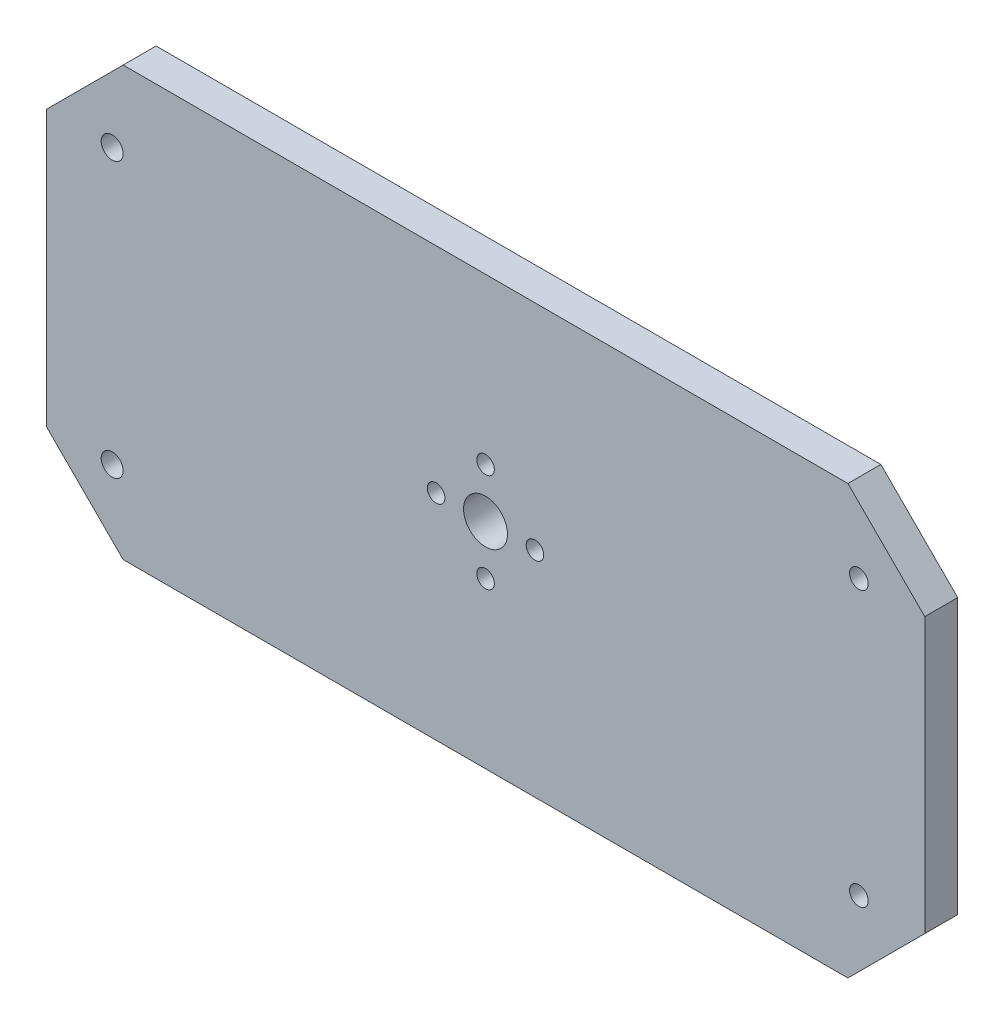
ISO-10303-21;
HEADER;
FILE_DESCRIPTION(('STEP AP214'),'2;1');
FILE_NAME('part.step','',(''),(''),'','','');
FILE_SCHEMA(('AUTOMOTIVE_DESIGN { 1 0 10303 214 1 1 1 1 }'));
ENDSEC;
DATA;
#1=APPLICATION_CONTEXT('core data for automotive mechanical design processes');
#2=APPLICATION_PROTOCOL_DEFINITION('international standard','automotive_design',2000,#1);
#3=PRODUCT_CONTEXT('',#1,'mechanical');
#4=PRODUCT('Part','Part','',(#3));
#5=PRODUCT_RELATED_PRODUCT_CATEGORY('part','',(#4));
#6=PRODUCT_DEFINITION_FORMATION('','',#4);
#7=PRODUCT_DEFINITION_CONTEXT('part definition',#1,'design');
#8=PRODUCT_DEFINITION('design','',#6,#7);
#9=PRODUCT_DEFINITION_SHAPE('','',#8);
#10=(LENGTH_UNIT() NAMED_UNIT(*) SI_UNIT(.MILLI.,.METRE.));
#11=(NAMED_UNIT(*) PLANE_ANGLE_UNIT() SI_UNIT($,.RADIAN.));
#12=(NAMED_UNIT(*) SI_UNIT($,.STERADIAN.) SOLID_ANGLE_UNIT());
#13=UNCERTAINTY_MEASURE_WITH_UNIT(LENGTH_MEASURE(1.E-05),#10,'distance_accuracy_value','');
#14=(GEOMETRIC_REPRESENTATION_CONTEXT(3) GLOBAL_UNCERTAINTY_ASSIGNED_CONTEXT((#13)) GLOBAL_UNIT_ASSIGNED_CONTEXT((#10,
#11,#12)) REPRESENTATION_CONTEXT('',''));
#15=CARTESIAN_POINT('',(0.,0.,0.));
#16=DIRECTION('',(0.,0.,1.));
#17=DIRECTION('',(1.,0.,0.));
#18=AXIS2_PLACEMENT_3D('',#15,#16,#17);
#19=CARTESIAN_POINT('',(0.,0.,6.));
#20=DIRECTION('',(0.,0.,1.));
#21=DIRECTION('',(1.,0.,0.));
#22=AXIS2_PLACEMENT_3D('',#19,#20,#21);
#23=PLANE('',#22);
#24=CARTESIAN_POINT('',(68.,-25.,6.));
#25=DIRECTION('',(0.,0.,1.));
#26=DIRECTION('',(1.,0.,0.));
#27=AXIS2_PLACEMENT_3D('',#24,#25,#26);
#28=CIRCLE('',#27,1.7);
#29=CARTESIAN_POINT('',(69.7,-25.,6.));
#30=VERTEX_POINT('',#29);
#31=EDGE_CURVE('E226',#30,#30,#28,.T.);
#32=ORIENTED_EDGE('',*,*,#31,.F.);
#33=EDGE_LOOP('',(#32));
#34=FACE_BOUND('',#33,.T.);
#35=CARTESIAN_POINT('',(-68.,-25.,6.));
#36=DIRECTION('',(0.,0.,1.));
#37=DIRECTION('',(1.,0.,0.));
#38=AXIS2_PLACEMENT_3D('',#35,#36,#37);
#39=CIRCLE('',#38,2.);
#40=CARTESIAN_POINT('',(-66.,-25.,6.));
#41=VERTEX_POINT('',#40);
#42=EDGE_CURVE('E214',#41,#41,#39,.T.);
#43=ORIENTED_EDGE('',*,*,#42,.F.);
#44=EDGE_LOOP('',(#43));
#45=FACE_BOUND('',#44,.T.);
#46=CARTESIAN_POINT('',(0.,9.,6.));
#47=DIRECTION('',(0.,0.,1.));
#48=DIRECTION('',(1.,0.,0.));
#49=AXIS2_PLACEMENT_3D('',#46,#47,#48);
#50=CIRCLE('',#49,1.6);
#51=CARTESIAN_POINT('',(1.6,9.,6.));
#52=VERTEX_POINT('',#51);
#53=EDGE_CURVE('E202',#52,#52,#50,.T.);
#54=ORIENTED_EDGE('',*,*,#53,.F.);
#55=EDGE_LOOP('',(#54));
#56=FACE_BOUND('',#55,.T.);
#57=CARTESIAN_POINT('',(-9.,0.,6.));
#58=DIRECTION('',(0.,0.,1.));
#59=DIRECTION('',(1.,0.,0.));
#60=AXIS2_PLACEMENT_3D('',#57,#58,#59);
#61=CIRCLE('',#60,1.6);
#62=CARTESIAN_POINT('',(-7.4,0.,6.));
#63=VERTEX_POINT('',#62);
#64=EDGE_CURVE('E190',#63,#63,#61,.T.);
#65=ORIENTED_EDGE('',*,*,#64,.F.);
#66=EDGE_LOOP('',(#65));
#67=FACE_BOUND('',#66,.T.);
#68=DIRECTION('',(0.707106781186544,-0.707106781186551,0.));
#69=VECTOR('',#68,1.);
#70=CARTESIAN_POINT('',(-79.9999999999999,-25.,6.));
#71=LINE('',#70,#69);
#72=CARTESIAN_POINT('',(-79.9999999999999,-25.,6.));
#73=VERTEX_POINT('',#72);
#74=CARTESIAN_POINT('',(-66.,-39.,6.));
#75=VERTEX_POINT('',#74);
#76=EDGE_CURVE('E153',#73,#75,#71,.T.);
#77=ORIENTED_EDGE('',*,*,#76,.T.);
#78=DIRECTION('',(1.,0.,0.));
#79=VECTOR('',#78,1.);
#80=CARTESIAN_POINT('',(-66.,-39.,6.));
#81=LINE('',#80,#79);
#82=CARTESIAN_POINT('',(66.,-39.,6.));
#83=VERTEX_POINT('',#82);
#84=EDGE_CURVE('E101',#75,#83,#81,.T.);
#85=ORIENTED_EDGE('',*,*,#84,.T.);
#86=DIRECTION('',(0.707106781186546,0.707106781186549,0.));
#87=VECTOR('',#86,1.);
#88=CARTESIAN_POINT('',(66.,-39.,6.));
#89=LINE('',#88,#87);
#90=CARTESIAN_POINT('',(80.,-25.,6.));
#91=VERTEX_POINT('',#90);
#92=EDGE_CURVE('E168',#83,#91,#89,.T.);
#93=ORIENTED_EDGE('',*,*,#92,.T.);
#94=DIRECTION('',(0.,1.,0.));
#95=VECTOR('',#94,1.);
#96=CARTESIAN_POINT('',(80.,-25.,6.));
#97=LINE('',#96,#95);
#98=CARTESIAN_POINT('',(80.,25.,6.));
#99=VERTEX_POINT('',#98);
#100=EDGE_CURVE('E181',#91,#99,#97,.T.);
#101=ORIENTED_EDGE('',*,*,#100,.T.);
#102=DIRECTION('',(-0.707106781186549,0.707106781186546,0.));
#103=VECTOR('',#102,1.);
#104=CARTESIAN_POINT('',(80.,25.,6.));
#105=LINE('',#104,#103);
#106=CARTESIAN_POINT('',(66.,38.9999999999999,6.));
#107=VERTEX_POINT('',#106);
#108=EDGE_CURVE('E120',#99,#107,#105,.T.);
#109=ORIENTED_EDGE('',*,*,#108,.T.);
#110=DIRECTION('',(-1.,0.,0.));
#111=VECTOR('',#110,1.);
#112=CARTESIAN_POINT('',(66.,38.9999999999999,6.));
#113=LINE('',#112,#111);
#114=CARTESIAN_POINT('',(-66.,38.9999999999999,6.));
#115=VERTEX_POINT('',#114);
#116=EDGE_CURVE('E114',#107,#115,#113,.T.);
#117=ORIENTED_EDGE('',*,*,#116,.T.);
#118=DIRECTION('',(-0.707106781186546,-0.707106781186549,0.));
#119=VECTOR('',#118,1.);
#120=CARTESIAN_POINT('',(-66.,38.9999999999999,6.));
#121=LINE('',#120,#119);
#122=CARTESIAN_POINT('',(-79.9999999999999,25.,6.));
#123=VERTEX_POINT('',#122);
#124=EDGE_CURVE('E118',#115,#123,#121,.T.);
#125=ORIENTED_EDGE('',*,*,#124,.T.);
#126=DIRECTION('',(0.,-1.,0.));
#127=VECTOR('',#126,1.);
#128=CARTESIAN_POINT('',(-79.9999999999999,25.,6.));
#129=LINE('',#128,#127);
#130=EDGE_CURVE('E58',#123,#73,#129,.T.);
#131=ORIENTED_EDGE('',*,*,#130,.T.);
#132=EDGE_LOOP('',(#77,#85,#93,#101,#109,#117,#125,#131));
#133=FACE_BOUND('',#132,.T.);
#134=CARTESIAN_POINT('',(0.,0.,6.));
#135=DIRECTION('',(0.,0.,1.));
#136=DIRECTION('',(1.,0.,0.));
#137=AXIS2_PLACEMENT_3D('',#134,#135,#136);
#138=CIRCLE('',#137,4.);
#139=CARTESIAN_POINT('',(4.,0.,6.));
#140=VERTEX_POINT('',#139);
#141=EDGE_CURVE('E142',#140,#140,#138,.T.);
#142=ORIENTED_EDGE('',*,*,#141,.F.);
#143=EDGE_LOOP('',(#142));
#144=FACE_BOUND('',#143,.T.);
#145=CARTESIAN_POINT('',(9.,0.,6.));
#146=DIRECTION('',(0.,0.,1.));
#147=DIRECTION('',(1.,0.,0.));
#148=AXIS2_PLACEMENT_3D('',#145,#146,#147);
#149=CIRCLE('',#148,1.6);
#150=CARTESIAN_POINT('',(10.6,0.,6.));
#151=VERTEX_POINT('',#150);
#152=EDGE_CURVE('E196',#151,#151,#149,.T.);
#153=ORIENTED_EDGE('',*,*,#152,.F.);
#154=EDGE_LOOP('',(#153));
#155=FACE_BOUND('',#154,.T.);
#156=CARTESIAN_POINT('',(0.,-9.,6.));
#157=DIRECTION('',(0.,0.,1.));
#158=DIRECTION('',(1.,0.,0.));
#159=AXIS2_PLACEMENT_3D('',#156,#157,#158);
#160=CIRCLE('',#159,1.6);
#161=CARTESIAN_POINT('',(1.6,-9.,6.));
#162=VERTEX_POINT('',#161);
#163=EDGE_CURVE('E208',#162,#162,#160,.T.);
#164=ORIENTED_EDGE('',*,*,#163,.F.);
#165=EDGE_LOOP('',(#164));
#166=FACE_BOUND('',#165,.T.);
#167=CARTESIAN_POINT('',(-68.,25.,6.));
#168=DIRECTION('',(0.,0.,1.));
#169=DIRECTION('',(1.,0.,0.));
#170=AXIS2_PLACEMENT_3D('',#167,#168,#169);
#171=CIRCLE('',#170,2.);
#172=CARTESIAN_POINT('',(-66.,25.,6.));
#173=VERTEX_POINT('',#172);
#174=EDGE_CURVE('E220',#173,#173,#171,.T.);
#175=ORIENTED_EDGE('',*,*,#174,.F.);
#176=EDGE_LOOP('',(#175));
#177=FACE_BOUND('',#176,.T.);
#178=CARTESIAN_POINT('',(68.,25.,6.));
#179=DIRECTION('',(0.,0.,1.));
#180=DIRECTION('',(1.,0.,0.));
#181=AXIS2_PLACEMENT_3D('',#178,#179,#180);
#182=CIRCLE('',#181,1.7);
#183=CARTESIAN_POINT('',(69.7,25.,6.));
#184=VERTEX_POINT('',#183);
#185=EDGE_CURVE('E232',#184,#184,#182,.T.);
#186=ORIENTED_EDGE('',*,*,#185,.F.);
#187=EDGE_LOOP('',(#186));
#188=FACE_BOUND('',#187,.T.);
#189=ADVANCED_FACE('F41',(#34,#45,#56,#67,#133,#144,#155,#166,#177,#188),#23,.T.);
#190=CARTESIAN_POINT('',(0.,0.,0.));
#191=DIRECTION('',(0.,0.,1.));
#192=DIRECTION('',(1.,0.,0.));
#193=AXIS2_PLACEMENT_3D('',#190,#191,#192);
#194=PLANE('',#193);
#195=DIRECTION('',(0.707106781186544,-0.707106781186551,0.));
#196=VECTOR('',#195,1.);
#197=CARTESIAN_POINT('',(-79.9999999999999,-25.,0.));
#198=LINE('',#197,#196);
#199=CARTESIAN_POINT('',(-79.9999999999999,-25.,0.));
#200=VERTEX_POINT('',#199);
#201=CARTESIAN_POINT('',(-66.,-39.,0.));
#202=VERTEX_POINT('',#201);
#203=EDGE_CURVE('E138',#200,#202,#198,.T.);
#204=ORIENTED_EDGE('',*,*,#203,.F.);
#205=DIRECTION('',(0.,-1.,0.));
#206=VECTOR('',#205,1.);
#207=CARTESIAN_POINT('',(-79.9999999999999,25.,0.));
#208=LINE('',#207,#206);
#209=CARTESIAN_POINT('',(-79.9999999999999,25.,0.));
#210=VERTEX_POINT('',#209);
#211=EDGE_CURVE('E93',#210,#200,#208,.T.);
#212=ORIENTED_EDGE('',*,*,#211,.F.);
#213=DIRECTION('',(-0.707106781186546,-0.707106781186549,0.));
#214=VECTOR('',#213,1.);
#215=CARTESIAN_POINT('',(-66.,38.9999999999999,0.));
#216=LINE('',#215,#214);
#217=CARTESIAN_POINT('',(-66.,38.9999999999999,0.));
#218=VERTEX_POINT('',#217);
#219=EDGE_CURVE('E87',#218,#210,#216,.T.);
#220=ORIENTED_EDGE('',*,*,#219,.F.);
#221=DIRECTION('',(-1.,0.,0.));
#222=VECTOR('',#221,1.);
#223=CARTESIAN_POINT('',(66.,38.9999999999999,0.));
#224=LINE('',#223,#222);
#225=CARTESIAN_POINT('',(66.,38.9999999999999,0.));
#226=VERTEX_POINT('',#225);
#227=EDGE_CURVE('E128',#226,#218,#224,.T.);
#228=ORIENTED_EDGE('',*,*,#227,.F.);
#229=DIRECTION('',(-0.707106781186549,0.707106781186546,0.));
#230=VECTOR('',#229,1.);
#231=CARTESIAN_POINT('',(80.,25.,0.));
#232=LINE('',#231,#230);
#233=CARTESIAN_POINT('',(80.,25.,0.));
#234=VERTEX_POINT('',#233);
#235=EDGE_CURVE('E148',#234,#226,#232,.T.);
#236=ORIENTED_EDGE('',*,*,#235,.F.);
#237=DIRECTION('',(0.,1.,0.));
#238=VECTOR('',#237,1.);
#239=CARTESIAN_POINT('',(80.,-25.,0.));
#240=LINE('',#239,#238);
#241=CARTESIAN_POINT('',(80.,-25.,0.));
#242=VERTEX_POINT('',#241);
#243=EDGE_CURVE('E146',#242,#234,#240,.T.);
#244=ORIENTED_EDGE('',*,*,#243,.F.);
#245=DIRECTION('',(0.707106781186546,0.707106781186549,0.));
#246=VECTOR('',#245,1.);
#247=CARTESIAN_POINT('',(66.,-39.,0.));
#248=LINE('',#247,#246);
#249=CARTESIAN_POINT('',(66.,-39.,0.));
#250=VERTEX_POINT('',#249);
#251=EDGE_CURVE('E144',#250,#242,#248,.T.);
#252=ORIENTED_EDGE('',*,*,#251,.F.);
#253=DIRECTION('',(1.,0.,0.));
#254=VECTOR('',#253,1.);
#255=CARTESIAN_POINT('',(-66.,-39.,0.));
#256=LINE('',#255,#254);
#257=EDGE_CURVE('E141',#202,#250,#256,.T.);
#258=ORIENTED_EDGE('',*,*,#257,.F.);
#259=EDGE_LOOP('',(#204,#212,#220,#228,#236,#244,#252,#258));
#260=FACE_BOUND('',#259,.T.);
#261=CARTESIAN_POINT('',(0.,0.,0.));
#262=DIRECTION('',(0.,0.,1.));
#263=DIRECTION('',(1.,0.,0.));
#264=AXIS2_PLACEMENT_3D('',#261,#262,#263);
#265=CIRCLE('',#264,4.);
#266=CARTESIAN_POINT('',(4.,0.,0.));
#267=VERTEX_POINT('',#266);
#268=EDGE_CURVE('E187',#267,#267,#265,.T.);
#269=ORIENTED_EDGE('',*,*,#268,.T.);
#270=EDGE_LOOP('',(#269));
#271=FACE_BOUND('',#270,.T.);
#272=CARTESIAN_POINT('',(-9.,0.,0.));
#273=DIRECTION('',(0.,0.,1.));
#274=DIRECTION('',(1.,0.,0.));
#275=AXIS2_PLACEMENT_3D('',#272,#273,#274);
#276=CIRCLE('',#275,1.6);
#277=CARTESIAN_POINT('',(-7.4,0.,0.));
#278=VERTEX_POINT('',#277);
#279=EDGE_CURVE('E193',#278,#278,#276,.T.);
#280=ORIENTED_EDGE('',*,*,#279,.T.);
#281=EDGE_LOOP('',(#280));
#282=FACE_BOUND('',#281,.T.);
#283=CARTESIAN_POINT('',(9.,0.,0.));
#284=DIRECTION('',(0.,0.,1.));
#285=DIRECTION('',(1.,0.,0.));
#286=AXIS2_PLACEMENT_3D('',#283,#284,#285);
#287=CIRCLE('',#286,1.6);
#288=CARTESIAN_POINT('',(10.6,0.,0.));
#289=VERTEX_POINT('',#288);
#290=EDGE_CURVE('E199',#289,#289,#287,.T.);
#291=ORIENTED_EDGE('',*,*,#290,.T.);
#292=EDGE_LOOP('',(#291));
#293=FACE_BOUND('',#292,.T.);
#294=CARTESIAN_POINT('',(0.,9.,0.));
#295=DIRECTION('',(0.,0.,1.));
#296=DIRECTION('',(1.,0.,0.));
#297=AXIS2_PLACEMENT_3D('',#294,#295,#296);
#298=CIRCLE('',#297,1.6);
#299=CARTESIAN_POINT('',(1.6,9.,0.));
#300=VERTEX_POINT('',#299);
#301=EDGE_CURVE('E205',#300,#300,#298,.T.);
#302=ORIENTED_EDGE('',*,*,#301,.T.);
#303=EDGE_LOOP('',(#302));
#304=FACE_BOUND('',#303,.T.);
#305=CARTESIAN_POINT('',(0.,-9.,0.));
#306=DIRECTION('',(0.,0.,1.));
#307=DIRECTION('',(1.,0.,0.));
#308=AXIS2_PLACEMENT_3D('',#305,#306,#307);
#309=CIRCLE('',#308,1.6);
#310=CARTESIAN_POINT('',(1.6,-9.,0.));
#311=VERTEX_POINT('',#310);
#312=EDGE_CURVE('E211',#311,#311,#309,.T.);
#313=ORIENTED_EDGE('',*,*,#312,.T.);
#314=EDGE_LOOP('',(#313));
#315=FACE_BOUND('',#314,.T.);
#316=CARTESIAN_POINT('',(-68.,-25.,0.));
#317=DIRECTION('',(0.,0.,1.));
#318=DIRECTION('',(1.,0.,0.));
#319=AXIS2_PLACEMENT_3D('',#316,#317,#318);
#320=CIRCLE('',#319,2.);
#321=CARTESIAN_POINT('',(-66.,-25.,0.));
#322=VERTEX_POINT('',#321);
#323=EDGE_CURVE('E217',#322,#322,#320,.T.);
#324=ORIENTED_EDGE('',*,*,#323,.T.);
#325=EDGE_LOOP('',(#324));
#326=FACE_BOUND('',#325,.T.);
#327=CARTESIAN_POINT('',(-68.,25.,0.));
#328=DIRECTION('',(0.,0.,1.));
#329=DIRECTION('',(1.,0.,0.));
#330=AXIS2_PLACEMENT_3D('',#327,#328,#329);
#331=CIRCLE('',#330,2.);
#332=CARTESIAN_POINT('',(-66.,25.,0.));
#333=VERTEX_POINT('',#332);
#334=EDGE_CURVE('E223',#333,#333,#331,.T.);
#335=ORIENTED_EDGE('',*,*,#334,.T.);
#336=EDGE_LOOP('',(#335));
#337=FACE_BOUND('',#336,.T.);
#338=CARTESIAN_POINT('',(68.,-25.,0.));
#339=DIRECTION('',(0.,0.,1.));
#340=DIRECTION('',(1.,0.,0.));
#341=AXIS2_PLACEMENT_3D('',#338,#339,#340);
#342=CIRCLE('',#341,1.7);
#343=CARTESIAN_POINT('',(69.7,-25.,0.));
#344=VERTEX_POINT('',#343);
#345=EDGE_CURVE('E229',#344,#344,#342,.T.);
#346=ORIENTED_EDGE('',*,*,#345,.T.);
#347=EDGE_LOOP('',(#346));
#348=FACE_BOUND('',#347,.T.);
#349=CARTESIAN_POINT('',(68.,25.,0.));
#350=DIRECTION('',(0.,0.,1.));
#351=DIRECTION('',(1.,0.,0.));
#352=AXIS2_PLACEMENT_3D('',#349,#350,#351);
#353=CIRCLE('',#352,1.7);
#354=CARTESIAN_POINT('',(69.7,25.,0.));
#355=VERTEX_POINT('',#354);
#356=EDGE_CURVE('E235',#355,#355,#353,.T.);
#357=ORIENTED_EDGE('',*,*,#356,.T.);
#358=EDGE_LOOP('',(#357));
#359=FACE_BOUND('',#358,.T.);
#360=ADVANCED_FACE('F172',(#260,#271,#282,#293,#304,#315,#326,#337,#348,#359),#194,.F.);
#361=CARTESIAN_POINT('',(-79.9999999999999,-25.,6.));
#362=DIRECTION('',(0.707106781186551,0.707106781186544,0.));
#363=DIRECTION('',(-0.707106781186544,0.707106781186551,0.));
#364=AXIS2_PLACEMENT_3D('',#361,#362,#363);
#365=PLANE('',#364);
#366=ORIENTED_EDGE('',*,*,#203,.T.);
#367=DIRECTION('',(0.,0.,-1.));
#368=VECTOR('',#367,1.);
#369=CARTESIAN_POINT('',(-66.,-39.,6.));
#370=LINE('',#369,#368);
#371=EDGE_CURVE('E11',#75,#202,#370,.T.);
#372=ORIENTED_EDGE('',*,*,#371,.F.);
#373=ORIENTED_EDGE('',*,*,#76,.F.);
#374=DIRECTION('',(0.,0.,-1.));
#375=VECTOR('',#374,1.);
#376=CARTESIAN_POINT('',(-79.9999999999999,-25.,6.));
#377=LINE('',#376,#375);
#378=EDGE_CURVE('E134',#73,#200,#377,.T.);
#379=ORIENTED_EDGE('',*,*,#378,.T.);
#380=EDGE_LOOP('',(#366,#372,#373,#379));
#381=FACE_BOUND('',#380,.T.);
#382=ADVANCED_FACE('F43',(#381),#365,.F.);
#383=CARTESIAN_POINT('',(-66.,-39.,6.));
#384=DIRECTION('',(0.,1.,0.));
#385=DIRECTION('',(0.,0.,1.));
#386=AXIS2_PLACEMENT_3D('',#383,#384,#385);
#387=PLANE('',#386);
#388=ORIENTED_EDGE('',*,*,#257,.T.);
#389=DIRECTION('',(0.,0.,-1.));
#390=VECTOR('',#389,1.);
#391=CARTESIAN_POINT('',(66.,-39.,6.));
#392=LINE('',#391,#390);
#393=EDGE_CURVE('E50',#83,#250,#392,.T.);
#394=ORIENTED_EDGE('',*,*,#393,.F.);
#395=ORIENTED_EDGE('',*,*,#84,.F.);
#396=ORIENTED_EDGE('',*,*,#371,.T.);
#397=EDGE_LOOP('',(#388,#394,#395,#396));
#398=FACE_BOUND('',#397,.T.);
#399=ADVANCED_FACE('F269',(#398),#387,.F.);
#400=CARTESIAN_POINT('',(66.,-39.,6.));
#401=DIRECTION('',(-0.707106781186549,0.707106781186546,0.));
#402=DIRECTION('',(-0.707106781186546,-0.707106781186549,0.));
#403=AXIS2_PLACEMENT_3D('',#400,#401,#402);
#404=PLANE('',#403);
#405=ORIENTED_EDGE('',*,*,#251,.T.);
#406=DIRECTION('',(0.,0.,-1.));
#407=VECTOR('',#406,1.);
#408=CARTESIAN_POINT('',(80.,-25.,6.));
#409=LINE('',#408,#407);
#410=EDGE_CURVE('E160',#91,#242,#409,.T.);
#411=ORIENTED_EDGE('',*,*,#410,.F.);
#412=ORIENTED_EDGE('',*,*,#92,.F.);
#413=ORIENTED_EDGE('',*,*,#393,.T.);
#414=EDGE_LOOP('',(#405,#411,#412,#413));
#415=FACE_BOUND('',#414,.T.);
#416=ADVANCED_FACE('F166',(#415),#404,.F.);
#417=CARTESIAN_POINT('',(80.,-25.,6.));
#418=DIRECTION('',(-1.,0.,0.));
#419=DIRECTION('',(0.,0.,1.));
#420=AXIS2_PLACEMENT_3D('',#417,#418,#419);
#421=PLANE('',#420);
#422=ORIENTED_EDGE('',*,*,#243,.T.);
#423=DIRECTION('',(0.,0.,-1.));
#424=VECTOR('',#423,1.);
#425=CARTESIAN_POINT('',(80.,25.,6.));
#426=LINE('',#425,#424);
#427=EDGE_CURVE('E157',#99,#234,#426,.T.);
#428=ORIENTED_EDGE('',*,*,#427,.F.);
#429=ORIENTED_EDGE('',*,*,#100,.F.);
#430=ORIENTED_EDGE('',*,*,#410,.T.);
#431=EDGE_LOOP('',(#422,#428,#429,#430));
#432=FACE_BOUND('',#431,.T.);
#433=ADVANCED_FACE('F177',(#432),#421,.F.);
#434=CARTESIAN_POINT('',(80.,25.,6.));
#435=DIRECTION('',(-0.707106781186546,-0.707106781186549,0.));
#436=DIRECTION('',(0.707106781186549,-0.707106781186546,0.));
#437=AXIS2_PLACEMENT_3D('',#434,#435,#436);
#438=PLANE('',#437);
#439=ORIENTED_EDGE('',*,*,#235,.T.);
#440=DIRECTION('',(0.,0.,-1.));
#441=VECTOR('',#440,1.);
#442=CARTESIAN_POINT('',(66.,38.9999999999999,6.));
#443=LINE('',#442,#441);
#444=EDGE_CURVE('E129',#107,#226,#443,.T.);
#445=ORIENTED_EDGE('',*,*,#444,.F.);
#446=ORIENTED_EDGE('',*,*,#108,.F.);
#447=ORIENTED_EDGE('',*,*,#427,.T.);
#448=EDGE_LOOP('',(#439,#445,#446,#447));
#449=FACE_BOUND('',#448,.T.);
#450=ADVANCED_FACE('F180',(#449),#438,.F.);
#451=CARTESIAN_POINT('',(66.,38.9999999999999,6.));
#452=DIRECTION('',(0.,-1.,0.));
#453=DIRECTION('',(0.,0.,-1.));
#454=AXIS2_PLACEMENT_3D('',#451,#452,#453);
#455=PLANE('',#454);
#456=ORIENTED_EDGE('',*,*,#227,.T.);
#457=DIRECTION('',(0.,0.,-1.));
#458=VECTOR('',#457,1.);
#459=CARTESIAN_POINT('',(-66.,38.9999999999999,6.));
#460=LINE('',#459,#458);
#461=EDGE_CURVE('E125',#115,#218,#460,.T.);
#462=ORIENTED_EDGE('',*,*,#461,.F.);
#463=ORIENTED_EDGE('',*,*,#116,.F.);
#464=ORIENTED_EDGE('',*,*,#444,.T.);
#465=EDGE_LOOP('',(#456,#462,#463,#464));
#466=FACE_BOUND('',#465,.T.);
#467=ADVANCED_FACE('F126',(#466),#455,.F.);
#468=CARTESIAN_POINT('',(-66.,38.9999999999999,6.));
#469=DIRECTION('',(0.707106781186549,-0.707106781186546,0.));
#470=DIRECTION('',(0.707106781186546,0.707106781186549,0.));
#471=AXIS2_PLACEMENT_3D('',#468,#469,#470);
#472=PLANE('',#471);
#473=ORIENTED_EDGE('',*,*,#219,.T.);
#474=DIRECTION('',(0.,0.,-1.));
#475=VECTOR('',#474,1.);
#476=CARTESIAN_POINT('',(-79.9999999999999,25.,6.));
#477=LINE('',#476,#475);
#478=EDGE_CURVE('E130',#123,#210,#477,.T.);
#479=ORIENTED_EDGE('',*,*,#478,.F.);
#480=ORIENTED_EDGE('',*,*,#124,.F.);
#481=ORIENTED_EDGE('',*,*,#461,.T.);
#482=EDGE_LOOP('',(#473,#479,#480,#481));
#483=FACE_BOUND('',#482,.T.);
#484=ADVANCED_FACE('F132',(#483),#472,.F.);
#485=CARTESIAN_POINT('',(-79.9999999999999,25.,6.));
#486=DIRECTION('',(1.,0.,0.));
#487=DIRECTION('',(0.,0.,-1.));
#488=AXIS2_PLACEMENT_3D('',#485,#486,#487);
#489=PLANE('',#488);
#490=ORIENTED_EDGE('',*,*,#211,.T.);
#491=ORIENTED_EDGE('',*,*,#378,.F.);
#492=ORIENTED_EDGE('',*,*,#130,.F.);
#493=ORIENTED_EDGE('',*,*,#478,.T.);
#494=EDGE_LOOP('',(#490,#491,#492,#493));
#495=FACE_BOUND('',#494,.T.);
#496=ADVANCED_FACE('F257',(#495),#489,.F.);
#497=CARTESIAN_POINT('',(0.,0.,6.));
#498=DIRECTION('',(0.,0.,-1.));
#499=DIRECTION('',(-1.,0.,0.));
#500=AXIS2_PLACEMENT_3D('',#497,#498,#499);
#501=CYLINDRICAL_SURFACE('',#500,4.);
#502=ORIENTED_EDGE('',*,*,#141,.T.);
#503=EDGE_LOOP('',(#502));
#504=FACE_BOUND('',#503,.T.);
#505=ORIENTED_EDGE('',*,*,#268,.F.);
#506=EDGE_LOOP('',(#505));
#507=FACE_BOUND('',#506,.T.);
#508=ADVANCED_FACE('F254',(#504,#507),#501,.F.);
#509=CARTESIAN_POINT('',(-9.,0.,6.));
#510=DIRECTION('',(0.,0.,-1.));
#511=DIRECTION('',(-1.,0.,0.));
#512=AXIS2_PLACEMENT_3D('',#509,#510,#511);
#513=CYLINDRICAL_SURFACE('',#512,1.6);
#514=ORIENTED_EDGE('',*,*,#64,.T.);
#515=EDGE_LOOP('',(#514));
#516=FACE_BOUND('',#515,.T.);
#517=ORIENTED_EDGE('',*,*,#279,.F.);
#518=EDGE_LOOP('',(#517));
#519=FACE_BOUND('',#518,.T.);
#520=ADVANCED_FACE('F332',(#516,#519),#513,.F.);
#521=CARTESIAN_POINT('',(9.,0.,6.));
#522=DIRECTION('',(0.,0.,-1.));
#523=DIRECTION('',(-1.,0.,0.));
#524=AXIS2_PLACEMENT_3D('',#521,#522,#523);
#525=CYLINDRICAL_SURFACE('',#524,1.6);
#526=ORIENTED_EDGE('',*,*,#152,.T.);
#527=EDGE_LOOP('',(#526));
#528=FACE_BOUND('',#527,.T.);
#529=ORIENTED_EDGE('',*,*,#290,.F.);
#530=EDGE_LOOP('',(#529));
#531=FACE_BOUND('',#530,.T.);
#532=ADVANCED_FACE('F340',(#528,#531),#525,.F.);
#533=CARTESIAN_POINT('',(0.,9.,6.));
#534=DIRECTION('',(0.,0.,-1.));
#535=DIRECTION('',(-1.,0.,0.));
#536=AXIS2_PLACEMENT_3D('',#533,#534,#535);
#537=CYLINDRICAL_SURFACE('',#536,1.6);
#538=ORIENTED_EDGE('',*,*,#53,.T.);
#539=EDGE_LOOP('',(#538));
#540=FACE_BOUND('',#539,.T.);
#541=ORIENTED_EDGE('',*,*,#301,.F.);
#542=EDGE_LOOP('',(#541));
#543=FACE_BOUND('',#542,.T.);
#544=ADVANCED_FACE('F348',(#540,#543),#537,.F.);
#545=CARTESIAN_POINT('',(0.,-9.,6.));
#546=DIRECTION('',(0.,0.,-1.));
#547=DIRECTION('',(-1.,0.,0.));
#548=AXIS2_PLACEMENT_3D('',#545,#546,#547);
#549=CYLINDRICAL_SURFACE('',#548,1.6);
#550=ORIENTED_EDGE('',*,*,#163,.T.);
#551=EDGE_LOOP('',(#550));
#552=FACE_BOUND('',#551,.T.);
#553=ORIENTED_EDGE('',*,*,#312,.F.);
#554=EDGE_LOOP('',(#553));
#555=FACE_BOUND('',#554,.T.);
#556=ADVANCED_FACE('F357',(#552,#555),#549,.F.);
#557=CARTESIAN_POINT('',(-68.,-25.,6.));
#558=DIRECTION('',(0.,0.,-1.));
#559=DIRECTION('',(-1.,0.,0.));
#560=AXIS2_PLACEMENT_3D('',#557,#558,#559);
#561=CYLINDRICAL_SURFACE('',#560,2.);
#562=ORIENTED_EDGE('',*,*,#42,.T.);
#563=EDGE_LOOP('',(#562));
#564=FACE_BOUND('',#563,.T.);
#565=ORIENTED_EDGE('',*,*,#323,.F.);
#566=EDGE_LOOP('',(#565));
#567=FACE_BOUND('',#566,.T.);
#568=ADVANCED_FACE('F366',(#564,#567),#561,.F.);
#569=CARTESIAN_POINT('',(-68.,25.,6.));
#570=DIRECTION('',(0.,0.,-1.));
#571=DIRECTION('',(-1.,0.,0.));
#572=AXIS2_PLACEMENT_3D('',#569,#570,#571);
#573=CYLINDRICAL_SURFACE('',#572,2.);
#574=ORIENTED_EDGE('',*,*,#174,.T.);
#575=EDGE_LOOP('',(#574));
#576=FACE_BOUND('',#575,.T.);
#577=ORIENTED_EDGE('',*,*,#334,.F.);
#578=EDGE_LOOP('',(#577));
#579=FACE_BOUND('',#578,.T.);
#580=ADVANCED_FACE('F375',(#576,#579),#573,.F.);
#581=CARTESIAN_POINT('',(68.,-25.,6.));
#582=DIRECTION('',(0.,0.,-1.));
#583=DIRECTION('',(-1.,0.,0.));
#584=AXIS2_PLACEMENT_3D('',#581,#582,#583);
#585=CYLINDRICAL_SURFACE('',#584,1.7);
#586=ORIENTED_EDGE('',*,*,#31,.T.);
#587=EDGE_LOOP('',(#586));
#588=FACE_BOUND('',#587,.T.);
#589=ORIENTED_EDGE('',*,*,#345,.F.);
#590=EDGE_LOOP('',(#589));
#591=FACE_BOUND('',#590,.T.);
#592=ADVANCED_FACE('F384',(#588,#591),#585,.F.);
#593=CARTESIAN_POINT('',(68.,25.,6.));
#594=DIRECTION('',(0.,0.,-1.));
#595=DIRECTION('',(-1.,0.,0.));
#596=AXIS2_PLACEMENT_3D('',#593,#594,#595);
#597=CYLINDRICAL_SURFACE('',#596,1.7);
#598=ORIENTED_EDGE('',*,*,#185,.T.);
#599=EDGE_LOOP('',(#598));
#600=FACE_BOUND('',#599,.T.);
#601=ORIENTED_EDGE('',*,*,#356,.F.);
#602=EDGE_LOOP('',(#601));
#603=FACE_BOUND('',#602,.T.);
#604=ADVANCED_FACE('F241',(#600,#603),#597,.F.);
#605=CLOSED_SHELL('',(#189,#360,#382,#399,#416,#433,#450,#467,#484,#496,#508,#520,#532,#544,
#556,#568,#580,#592,#604));
#606=MANIFOLD_SOLID_BREP('B2',#605);
#607=ADVANCED_BREP_SHAPE_REPRESENTATION('',(#18,#606),#14);
#608=SHAPE_DEFINITION_REPRESENTATION(#9,#607);
ENDSEC;
END-ISO-10303-21;
